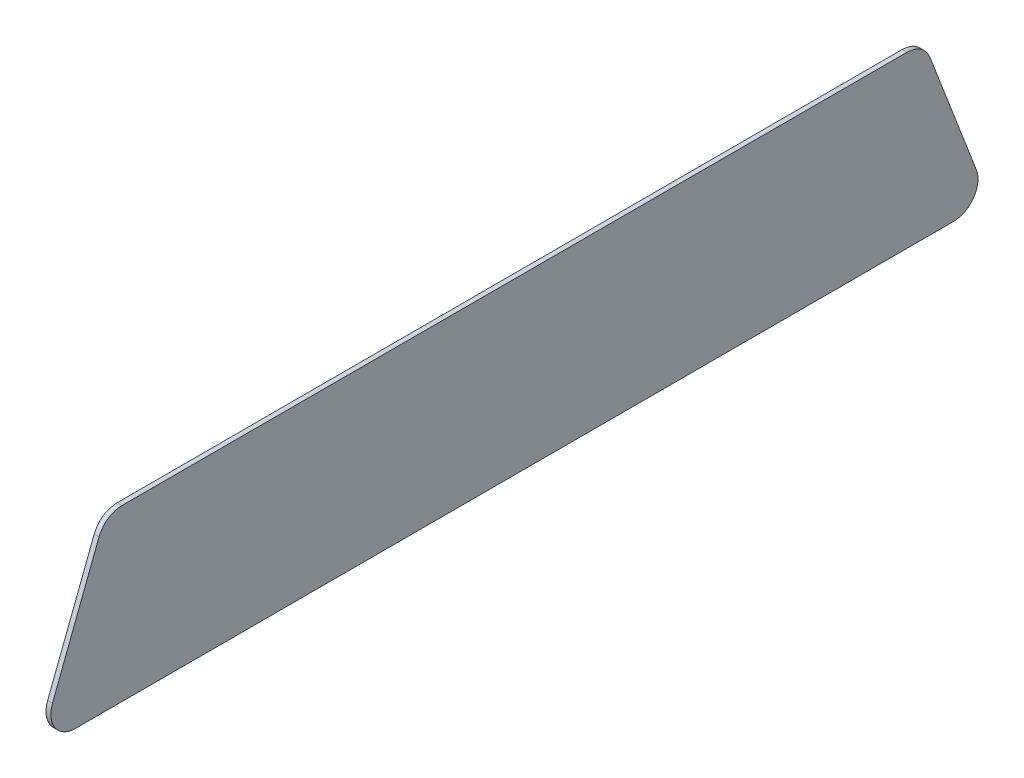
ISO-10303-21;
HEADER;
FILE_DESCRIPTION(('STEP AP214'),'2;1');
FILE_NAME('part.step','',(''),(''),'','','');
FILE_SCHEMA(('AUTOMOTIVE_DESIGN { 1 0 10303 214 1 1 1 1 }'));
ENDSEC;
DATA;
#1=APPLICATION_CONTEXT('core data for automotive mechanical design processes');
#2=APPLICATION_PROTOCOL_DEFINITION('international standard','automotive_design',2000,#1);
#3=PRODUCT_CONTEXT('',#1,'mechanical');
#4=PRODUCT('Part','Part','',(#3));
#5=PRODUCT_RELATED_PRODUCT_CATEGORY('part','',(#4));
#6=PRODUCT_DEFINITION_FORMATION('','',#4);
#7=PRODUCT_DEFINITION_CONTEXT('part definition',#1,'design');
#8=PRODUCT_DEFINITION('design','',#6,#7);
#9=PRODUCT_DEFINITION_SHAPE('','',#8);
#10=(LENGTH_UNIT() NAMED_UNIT(*) SI_UNIT(.MILLI.,.METRE.));
#11=(NAMED_UNIT(*) PLANE_ANGLE_UNIT() SI_UNIT($,.RADIAN.));
#12=(NAMED_UNIT(*) SI_UNIT($,.STERADIAN.) SOLID_ANGLE_UNIT());
#13=UNCERTAINTY_MEASURE_WITH_UNIT(LENGTH_MEASURE(1.E-05),#10,'distance_accuracy_value','');
#14=(GEOMETRIC_REPRESENTATION_CONTEXT(3) GLOBAL_UNCERTAINTY_ASSIGNED_CONTEXT((#13)) GLOBAL_UNIT_ASSIGNED_CONTEXT((#10,
#11,#12)) REPRESENTATION_CONTEXT('',''));
#15=CARTESIAN_POINT('',(0.,0.,0.));
#16=DIRECTION('',(0.,0.,1.));
#17=DIRECTION('',(1.,0.,0.));
#18=AXIS2_PLACEMENT_3D('',#15,#16,#17);
#19=CARTESIAN_POINT('',(250.,-10.4483905401593,-69.5713618482532));
#20=DIRECTION('',(-1.,0.,0.));
#21=DIRECTION('',(0.,0.,1.));
#22=AXIS2_PLACEMENT_3D('',#19,#20,#21);
#23=CYLINDRICAL_SURFACE('',#22,10.1519224698779);
#24=DIRECTION('',(1.,0.,0.));
#25=VECTOR('',#24,1.);
#26=CARTESIAN_POINT('',(250.,-6.79731489157442,-60.0987077089571));
#27=LINE('',#26,#25);
#28=CARTESIAN_POINT('',(248.,-6.79731489157442,-60.0987077089571));
#29=VERTEX_POINT('',#28);
#30=CARTESIAN_POINT('',(250.,-6.79731489157442,-60.0987077089571));
#31=VERTEX_POINT('',#30);
#32=EDGE_CURVE('E13',#29,#31,#27,.T.);
#33=ORIENTED_EDGE('',*,*,#32,.F.);
#34=CARTESIAN_POINT('',(248.,-10.4483905401593,-69.5713618482532));
#35=DIRECTION('',(1.,0.,0.));
#36=DIRECTION('',(0.,0.,-1.));
#37=AXIS2_PLACEMENT_3D('',#34,#35,#36);
#38=CIRCLE('',#37,10.1519224698779);
#39=CARTESIAN_POINT('',(248.,-20.6003130100372,-69.5713618482533));
#40=VERTEX_POINT('',#39);
#41=EDGE_CURVE('E372',#29,#40,#38,.T.);
#42=ORIENTED_EDGE('',*,*,#41,.T.);
#43=DIRECTION('',(1.,0.,0.));
#44=VECTOR('',#43,1.);
#45=CARTESIAN_POINT('',(250.,-20.6003130100372,-69.5713618482533));
#46=LINE('',#45,#44);
#47=CARTESIAN_POINT('',(250.,-20.6003130100372,-69.5713618482533));
#48=VERTEX_POINT('',#47);
#49=EDGE_CURVE('E314',#40,#48,#46,.T.);
#50=ORIENTED_EDGE('',*,*,#49,.T.);
#51=CARTESIAN_POINT('',(250.,-10.4483905401593,-69.5713618482532));
#52=DIRECTION('',(1.,0.,0.));
#53=DIRECTION('',(0.,0.,-1.));
#54=AXIS2_PLACEMENT_3D('',#51,#52,#53);
#55=CIRCLE('',#54,10.1519224698779);
#56=EDGE_CURVE('E435',#31,#48,#55,.T.);
#57=ORIENTED_EDGE('',*,*,#56,.F.);
#58=EDGE_LOOP('',(#33,#42,#50,#57));
#59=FACE_BOUND('',#58,.T.);
#60=ADVANCED_FACE('F303',(#59),#23,.T.);
#61=CARTESIAN_POINT('',(250.,-20.6003130100372,-69.5713618482533));
#62=DIRECTION('',(0.,1.,0.));
#63=DIRECTION('',(0.,0.,-1.));
#64=AXIS2_PLACEMENT_3D('',#61,#62,#63);
#65=PLANE('',#64);
#66=ORIENTED_EDGE('',*,*,#49,.F.);
#67=DIRECTION('',(0.,0.,1.));
#68=VECTOR('',#67,1.);
#69=CARTESIAN_POINT('',(248.,-20.6003130100372,-83.0756903566517));
#70=LINE('',#69,#68);
#71=CARTESIAN_POINT('',(248.,-20.6003130100367,-433.103549609214));
#72=VERTEX_POINT('',#71);
#73=EDGE_CURVE('E407',#40,#72,#70,.F.);
#74=ORIENTED_EDGE('',*,*,#73,.T.);
#75=DIRECTION('',(1.,0.,0.));
#76=VECTOR('',#75,1.);
#77=CARTESIAN_POINT('',(250.,-20.6003130100367,-433.103549609214));
#78=LINE('',#77,#76);
#79=CARTESIAN_POINT('',(250.,-20.6003130100367,-433.103549609214));
#80=VERTEX_POINT('',#79);
#81=EDGE_CURVE('E426',#72,#80,#78,.T.);
#82=ORIENTED_EDGE('',*,*,#81,.T.);
#83=DIRECTION('',(0.,0.,-1.));
#84=VECTOR('',#83,1.);
#85=CARTESIAN_POINT('',(250.,-20.6003130100372,-69.5713618482533));
#86=LINE('',#85,#84);
#87=EDGE_CURVE('E444',#48,#80,#86,.T.);
#88=ORIENTED_EDGE('',*,*,#87,.F.);
#89=EDGE_LOOP('',(#66,#74,#82,#88));
#90=FACE_BOUND('',#89,.T.);
#91=ADVANCED_FACE('F448',(#90),#65,.F.);
#92=CARTESIAN_POINT('',(250.,-10.4483905401589,-433.103549609214));
#93=DIRECTION('',(-1.,0.,0.));
#94=DIRECTION('',(0.,0.,1.));
#95=AXIS2_PLACEMENT_3D('',#92,#93,#94);
#96=CYLINDRICAL_SURFACE('',#95,10.1519224698778);
#97=ORIENTED_EDGE('',*,*,#81,.F.);
#98=CARTESIAN_POINT('',(248.,-10.4483905401589,-433.103549609214));
#99=DIRECTION('',(1.,0.,0.));
#100=DIRECTION('',(0.,0.,-1.));
#101=AXIS2_PLACEMENT_3D('',#98,#99,#100);
#102=CIRCLE('',#101,10.1519224698778);
#103=CARTESIAN_POINT('',(248.,-6.80393298914264,-442.578751928597));
#104=VERTEX_POINT('',#103);
#105=EDGE_CURVE('E403',#72,#104,#102,.T.);
#106=ORIENTED_EDGE('',*,*,#105,.T.);
#107=DIRECTION('',(1.,0.,0.));
#108=VECTOR('',#107,1.);
#109=CARTESIAN_POINT('',(250.,-6.80393298914264,-442.578751928597));
#110=LINE('',#109,#108);
#111=CARTESIAN_POINT('',(250.,-6.80393298914264,-442.578751928597));
#112=VERTEX_POINT('',#111);
#113=EDGE_CURVE('E422',#104,#112,#110,.T.);
#114=ORIENTED_EDGE('',*,*,#113,.T.);
#115=CARTESIAN_POINT('',(250.,-10.4483905401589,-433.103549609214));
#116=DIRECTION('',(1.,0.,0.));
#117=DIRECTION('',(0.,0.,-1.));
#118=AXIS2_PLACEMENT_3D('',#115,#116,#117);
#119=CIRCLE('',#118,10.1519224698778);
#120=EDGE_CURVE('E450',#80,#112,#119,.T.);
#121=ORIENTED_EDGE('',*,*,#120,.F.);
#122=EDGE_LOOP('',(#97,#106,#114,#121));
#123=FACE_BOUND('',#122,.T.);
#124=ADVANCED_FACE('F479',(#123),#96,.T.);
#125=CARTESIAN_POINT('',(250.,-6.80393298914264,-442.578751928597));
#126=DIRECTION('',(0.,-0.358991862066535,0.93334068965732));
#127=DIRECTION('',(0.,0.93334068965732,0.358991862066535));
#128=AXIS2_PLACEMENT_3D('',#125,#126,#127);
#129=PLANE('',#128);
#130=ORIENTED_EDGE('',*,*,#113,.F.);
#131=DIRECTION('',(0.,0.93334068965732,0.358991862066535));
#132=VECTOR('',#131,1.);
#133=CARTESIAN_POINT('',(248.,-6.80393298914264,-442.578751928597));
#134=LINE('',#133,#132);
#135=CARTESIAN_POINT('',(248.,43.198495664848,-423.34626247511));
#136=VERTEX_POINT('',#135);
#137=EDGE_CURVE('E396',#104,#136,#134,.T.);
#138=ORIENTED_EDGE('',*,*,#137,.T.);
#139=DIRECTION('',(1.,0.,0.));
#140=VECTOR('',#139,1.);
#141=CARTESIAN_POINT('',(250.,43.198495664848,-423.34626247511));
#142=LINE('',#141,#140);
#143=CARTESIAN_POINT('',(250.,43.198495664848,-423.34626247511));
#144=VERTEX_POINT('',#143);
#145=EDGE_CURVE('E418',#136,#144,#142,.T.);
#146=ORIENTED_EDGE('',*,*,#145,.T.);
#147=DIRECTION('',(0.,0.93334068965732,0.358991862066535));
#148=VECTOR('',#147,1.);
#149=CARTESIAN_POINT('',(250.,-6.80393298914264,-442.578751928597));
#150=LINE('',#149,#148);
#151=EDGE_CURVE('E453',#112,#144,#150,.T.);
#152=ORIENTED_EDGE('',*,*,#151,.F.);
#153=EDGE_LOOP('',(#130,#138,#146,#152));
#154=FACE_BOUND('',#153,.T.);
#155=ADVANCED_FACE('F474',(#154),#129,.F.);
#156=CARTESIAN_POINT('',(250.,43.198495664848,-423.34626247511));
#157=CARTESIAN_POINT('',(250.,49.3584780598115,-420.675389237548));
#158=CARTESIAN_POINT('',(250.,49.7059605837122,-413.871060155725));
#159=B_SPLINE_CURVE_WITH_KNOTS('',2,(#156,#157,#158),.UNSPECIFIED.,.F.,.F.,(3,3),(0.,1.),.UNSPECIFIED.);
#160=DIRECTION('',(-1.,0.,0.));
#161=VECTOR('',#160,1.);
#162=SURFACE_OF_LINEAR_EXTRUSION('',#159,#161);
#163=ORIENTED_EDGE('',*,*,#145,.F.);
#164=CARTESIAN_POINT('',(248.,43.198495664848,-423.34626247511));
#165=CARTESIAN_POINT('',(248.,49.3584780598115,-420.675389237548));
#166=CARTESIAN_POINT('',(248.,49.7059605837122,-413.871060155725));
#167=B_SPLINE_CURVE_WITH_KNOTS('',2,(#164,#165,#166),.UNSPECIFIED.,.F.,.F.,(3,3),(0.,1.),.UNSPECIFIED.);
#168=CARTESIAN_POINT('',(248.,49.7059605837122,-413.871060155725));
#169=VERTEX_POINT('',#168);
#170=EDGE_CURVE('E390',#136,#169,#167,.T.);
#171=ORIENTED_EDGE('',*,*,#170,.T.);
#172=DIRECTION('',(1.,0.,0.));
#173=VECTOR('',#172,1.);
#174=CARTESIAN_POINT('',(250.,49.7059605837122,-413.871060155725));
#175=LINE('',#174,#173);
#176=CARTESIAN_POINT('',(250.,49.7059605837122,-413.871060155725));
#177=VERTEX_POINT('',#176);
#178=EDGE_CURVE('E415',#169,#177,#175,.T.);
#179=ORIENTED_EDGE('',*,*,#178,.T.);
#180=EDGE_CURVE('E459',#144,#177,#159,.T.);
#181=ORIENTED_EDGE('',*,*,#180,.F.);
#182=EDGE_LOOP('',(#163,#171,#179,#181));
#183=FACE_BOUND('',#182,.T.);
#184=ADVANCED_FACE('F469',(#183),#162,.F.);
#185=CARTESIAN_POINT('',(250.,49.7059605837122,-413.871060155725));
#186=DIRECTION('',(0.,-1.,0.));
#187=DIRECTION('',(0.,0.,1.));
#188=AXIS2_PLACEMENT_3D('',#185,#186,#187);
#189=PLANE('',#188);
#190=ORIENTED_EDGE('',*,*,#178,.F.);
#191=DIRECTION('',(0.,0.,1.));
#192=VECTOR('',#191,1.);
#193=CARTESIAN_POINT('',(248.,49.7059605837122,-83.0756903566517));
#194=LINE('',#193,#192);
#195=CARTESIAN_POINT('',(248.,49.7059605837122,-88.8439592580283));
#196=VERTEX_POINT('',#195);
#197=EDGE_CURVE('E383',#169,#196,#194,.T.);
#198=ORIENTED_EDGE('',*,*,#197,.T.);
#199=DIRECTION('',(1.,0.,0.));
#200=VECTOR('',#199,1.);
#201=CARTESIAN_POINT('',(250.,49.7059605837122,-88.8439592580283));
#202=LINE('',#201,#200);
#203=CARTESIAN_POINT('',(250.,49.7059605837122,-88.8439592580283));
#204=VERTEX_POINT('',#203);
#205=EDGE_CURVE('E322',#196,#204,#202,.T.);
#206=ORIENTED_EDGE('',*,*,#205,.T.);
#207=DIRECTION('',(0.,0.,1.));
#208=VECTOR('',#207,1.);
#209=CARTESIAN_POINT('',(250.,49.7059605837122,-413.871060155725));
#210=LINE('',#209,#208);
#211=EDGE_CURVE('E365',#177,#204,#210,.T.);
#212=ORIENTED_EDGE('',*,*,#211,.F.);
#213=EDGE_LOOP('',(#190,#198,#206,#212));
#214=FACE_BOUND('',#213,.T.);
#215=ADVANCED_FACE('F473',(#214),#189,.F.);
#216=CARTESIAN_POINT('',(250.,49.7059605837121,-88.8439592580283));
#217=CARTESIAN_POINT('',(250.,49.3588628944782,-82.043748524923));
#218=CARTESIAN_POINT('',(250.,43.2051137624193,-79.3713051187323));
#219=B_SPLINE_CURVE_WITH_KNOTS('',2,(#216,#217,#218),.UNSPECIFIED.,.F.,.F.,(3,3),(0.,1.),.UNSPECIFIED.);
#220=DIRECTION('',(-1.,0.,0.));
#221=VECTOR('',#220,1.);
#222=SURFACE_OF_LINEAR_EXTRUSION('',#219,#221);
#223=ORIENTED_EDGE('',*,*,#205,.F.);
#224=CARTESIAN_POINT('',(248.,49.7059605837121,-88.8439592580283));
#225=CARTESIAN_POINT('',(248.,49.3588628944782,-82.043748524923));
#226=CARTESIAN_POINT('',(248.,43.2051137624193,-79.3713051187323));
#227=B_SPLINE_CURVE_WITH_KNOTS('',2,(#224,#225,#226),.UNSPECIFIED.,.F.,.F.,(3,3),(0.,1.),.UNSPECIFIED.);
#228=CARTESIAN_POINT('',(248.,43.2051137624194,-79.3713051187323));
#229=VERTEX_POINT('',#228);
#230=EDGE_CURVE('E370',#196,#229,#227,.T.);
#231=ORIENTED_EDGE('',*,*,#230,.T.);
#232=DIRECTION('',(1.,0.,0.));
#233=VECTOR('',#232,1.);
#234=CARTESIAN_POINT('',(250.,43.2051137624194,-79.3713051187323));
#235=LINE('',#234,#233);
#236=CARTESIAN_POINT('',(250.,43.2051137624194,-79.3713051187323));
#237=VERTEX_POINT('',#236);
#238=EDGE_CURVE('E307',#229,#237,#235,.T.);
#239=ORIENTED_EDGE('',*,*,#238,.T.);
#240=EDGE_CURVE('E389',#204,#237,#219,.T.);
#241=ORIENTED_EDGE('',*,*,#240,.F.);
#242=EDGE_LOOP('',(#223,#231,#239,#241));
#243=FACE_BOUND('',#242,.T.);
#244=ADVANCED_FACE('F375',(#243),#222,.F.);
#245=CARTESIAN_POINT('',(250.,43.2051137624194,-79.3713051187323));
#246=DIRECTION('',(0.,-0.359643767908786,-0.933089684973728));
#247=DIRECTION('',(0.,-0.933089684973728,0.359643767908786));
#248=AXIS2_PLACEMENT_3D('',#245,#246,#247);
#249=PLANE('',#248);
#250=DIRECTION('',(0.,-0.933089684973728,0.359643767908786));
#251=VECTOR('',#250,1.);
#252=CARTESIAN_POINT('',(248.,43.2051137624194,-79.3713051187323));
#253=LINE('',#252,#251);
#254=EDGE_CURVE('E358',#229,#29,#253,.T.);
#255=ORIENTED_EDGE('',*,*,#254,.T.);
#256=ORIENTED_EDGE('',*,*,#32,.T.);
#257=DIRECTION('',(0.,-0.933089684973728,0.359643767908786));
#258=VECTOR('',#257,1.);
#259=CARTESIAN_POINT('',(250.,43.2051137624194,-79.3713051187323));
#260=LINE('',#259,#258);
#261=EDGE_CURVE('E360',#237,#31,#260,.T.);
#262=ORIENTED_EDGE('',*,*,#261,.F.);
#263=ORIENTED_EDGE('',*,*,#238,.F.);
#264=EDGE_LOOP('',(#255,#256,#262,#263));
#265=FACE_BOUND('',#264,.T.);
#266=ADVANCED_FACE('F305',(#265),#249,.F.);
#267=CARTESIAN_POINT('',(250.,47.907200033772,-83.0756903566517));
#268=DIRECTION('',(-1.,0.,0.));
#269=DIRECTION('',(0.,0.,1.));
#270=AXIS2_PLACEMENT_3D('',#267,#268,#269);
#271=PLANE('',#270);
#272=ORIENTED_EDGE('',*,*,#240,.T.);
#273=ORIENTED_EDGE('',*,*,#261,.T.);
#274=ORIENTED_EDGE('',*,*,#56,.T.);
#275=ORIENTED_EDGE('',*,*,#87,.T.);
#276=ORIENTED_EDGE('',*,*,#120,.T.);
#277=ORIENTED_EDGE('',*,*,#151,.T.);
#278=ORIENTED_EDGE('',*,*,#180,.T.);
#279=ORIENTED_EDGE('',*,*,#211,.T.);
#280=EDGE_LOOP('',(#272,#273,#274,#275,#276,#277,#278,#279));
#281=FACE_BOUND('',#280,.T.);
#282=ADVANCED_FACE('F442',(#281),#271,.F.);
#283=CARTESIAN_POINT('',(248.,47.907200033772,-83.0756903566517));
#284=DIRECTION('',(-1.,0.,0.));
#285=DIRECTION('',(0.,0.,1.));
#286=AXIS2_PLACEMENT_3D('',#283,#284,#285);
#287=PLANE('',#286);
#288=ORIENTED_EDGE('',*,*,#230,.F.);
#289=ORIENTED_EDGE('',*,*,#197,.F.);
#290=ORIENTED_EDGE('',*,*,#170,.F.);
#291=ORIENTED_EDGE('',*,*,#137,.F.);
#292=ORIENTED_EDGE('',*,*,#105,.F.);
#293=ORIENTED_EDGE('',*,*,#73,.F.);
#294=ORIENTED_EDGE('',*,*,#41,.F.);
#295=ORIENTED_EDGE('',*,*,#254,.F.);
#296=EDGE_LOOP('',(#288,#289,#290,#291,#292,#293,#294,#295));
#297=FACE_BOUND('',#296,.T.);
#298=ADVANCED_FACE('F368',(#297),#287,.T.);
#299=CLOSED_SHELL('',(#60,#91,#124,#155,#184,#215,#244,#266,#282,#298));
#300=MANIFOLD_SOLID_BREP('B2',#299);
#301=CARTESIAN_POINT('',(250.,49.7059605837121,-88.8439592580283));
#302=CARTESIAN_POINT('',(248.120614758428,49.0228096267602,-88.878828783086));
#303=CARTESIAN_POINT('',(250.,49.677035776276,-88.2772750302695));
#304=CARTESIAN_POINT('',(248.120614758428,48.9785197893924,-88.3507156895247));
#305=CARTESIAN_POINT('',(250.,49.5587002088742,-87.186904151074));
#306=CARTESIAN_POINT('',(248.120614758428,48.8899401146567,-87.2944895024021));
#307=CARTESIAN_POINT('',(250.,49.080085263953,-85.1781526979711));
#308=CARTESIAN_POINT('',(248.120614758428,48.4266517342813,-85.4143255546724));
#309=CARTESIAN_POINT('',(250.,48.0281719388308,-82.9896952040076));
#310=CARTESIAN_POINT('',(248.120614758428,47.4574860992813,-83.3807786643272));
#311=CARTESIAN_POINT('',(250.,46.3713990884144,-81.2312134732644));
#312=CARTESIAN_POINT('',(248.120614758428,45.9168891842483,-81.7570867172908));
#313=CARTESIAN_POINT('',(250.,44.6830650929046,-80.082413546602));
#314=CARTESIAN_POINT('',(248.120614758428,44.3453805688914,-80.6695969880209));
#315=CARTESIAN_POINT('',(250.,43.7179261900909,-79.5940087359148));
#316=CARTESIAN_POINT('',(248.120614758428,43.4035500958147,-80.2223546560242));
#317=CARTESIAN_POINT('',(250.,43.2051137624193,-79.3713051187323));
#318=CARTESIAN_POINT('',(248.120614758428,42.9326348592764,-79.9987334900258));
#319=B_SPLINE_SURFACE_WITH_KNOTS('',3,1,((#301,#302),(#303,#304),(#305,#306),(#307,#308),(#309,
#310),(#311,#312),(#313,#314),(#315,#316),(#317,#318)),.UNSPECIFIED.,.F.,.F.,.F.,(4,1,1,1,1,1,
4),(2,2),(0.,0.125,0.25,0.5,0.75,0.875,1.),(0.,1.),.UNSPECIFIED.);
#320=CARTESIAN_POINT('',(249.999999999976,43.2051137624158,-79.3713051187404));
#321=CARTESIAN_POINT('',(249.939418540685,43.1967525329749,-79.3917134154622));
#322=CARTESIAN_POINT('',(249.878837303244,43.188359619844,-79.4121093522091));
#323=CARTESIAN_POINT('',(249.752610085859,43.1708171223944,-79.4545851255414));
#324=CARTESIAN_POINT('',(249.686964142151,43.1616629443372,-79.4766631731117));
#325=CARTESIAN_POINT('',(249.550607514392,43.1425979879657,-79.522503278767));
#326=CARTESIAN_POINT('',(249.479896866659,43.1326833309909,-79.5462638305783));
#327=CARTESIAN_POINT('',(249.333410830455,43.1120964208663,-79.5954685982955));
#328=CARTESIAN_POINT('',(249.257635476825,43.1014207738831,-79.6209114976336));
#329=CARTESIAN_POINT('',(249.101020030697,43.0793114620444,-79.673480812223));
#330=CARTESIAN_POINT('',(249.020179970888,43.0678748292022,-79.7006060762053));
#331=CARTESIAN_POINT('',(248.853435114742,43.0442431379303,-79.7565399467413));
#332=CARTESIAN_POINT('',(248.76753034842,43.0320454580677,-79.7853475350029));
#333=CARTESIAN_POINT('',(248.590656081453,43.0068915432306,-79.8446459599084));
#334=CARTESIAN_POINT('',(248.49968660778,42.9939329883693,-79.8751358926654));
#335=CARTESIAN_POINT('',(248.312682931429,42.9672568784064,-79.9377987595103));
#336=CARTESIAN_POINT('',(248.21664875262,42.9535372369217,-79.9699708767462));
#337=CARTESIAN_POINT('',(248.120614758428,42.9398010468146,-80.0021364672718));
#338=B_SPLINE_CURVE_WITH_KNOTS('',3,(#320,#321,#322,#323,#324,#325,#326,#327,#328,#329,#330,
#331,#332,#333,#334,#335,#336,#337),.UNSPECIFIED.,.F.,.F.,(4,2,2,2,2,2,2,2,4),(0.,
0.193413255206542,0.402997724406666,0.628753635484742,0.870681155796118,1.12878039906253,
1.40305143027257,1.69349426924378,2.00010889325958),.UNSPECIFIED.);
#339=CARTESIAN_POINT('',(248.120614758428,42.9398010327751,-80.0021364606049));
#340=VERTEX_POINT('',#339);
#341=CARTESIAN_POINT('',(249.999999999994,43.2051137624185,-79.3713051187343));
#342=VERTEX_POINT('',#341);
#343=EDGE_CURVE('E599',#340,#342,#338,.F.);
#344=CARTESIAN_POINT('',(248.120614758428,49.0228096267602,-88.878828783086));
#345=CARTESIAN_POINT('',(248.120614758428,48.9785197893924,-88.3507156895247));
#346=CARTESIAN_POINT('',(248.120614758428,48.8899401146567,-87.2944895024021));
#347=CARTESIAN_POINT('',(248.120614758428,48.4266517342813,-85.4143255546724));
#348=CARTESIAN_POINT('',(248.120614758428,47.4574860992813,-83.3807786643272));
#349=CARTESIAN_POINT('',(248.120614758428,45.9168891842483,-81.7570867172908));
#350=CARTESIAN_POINT('',(248.120614758428,44.3453805688914,-80.6695969880209));
#351=CARTESIAN_POINT('',(248.120614758428,43.4035500958147,-80.2223546560242));
#352=CARTESIAN_POINT('',(248.120614758428,42.9326348592764,-79.9987334900258));
#353=B_SPLINE_CURVE_WITH_KNOTS('',3,(#344,#345,#346,#347,#348,#349,#350,#351,#352),
.UNSPECIFIED.,.F.,.F.,(4,1,1,1,1,1,4),(0.,0.125,0.25,0.5,0.75,0.875,1.),.UNSPECIFIED.);
#354=CARTESIAN_POINT('',(248.120614758428,49.0219202970608,-88.8682245307919));
#355=VERTEX_POINT('',#354);
#356=EDGE_CURVE('E752',#340,#355,#353,.F.);
#357=CARTESIAN_POINT('',(248.120614758428,49.0219202970608,-88.8682245307919));
#358=CARTESIAN_POINT('',(249.262704108098,49.4376068252132,-88.8508034856746));
#359=CARTESIAN_POINT('',(249.999999999941,49.7059605836908,-88.8439592580293));
#360=B_SPLINE_CURVE_WITH_KNOTS('',2,(#357,#358,#359),.UNSPECIFIED.,.F.,.F.,(3,3),(0.,1.),.UNSPECIFIED.);
#361=CARTESIAN_POINT('',(249.999999999971,49.7059605837015,-88.8439592580288));
#362=VERTEX_POINT('',#361);
#363=EDGE_CURVE('E590',#362,#355,#360,.F.);
#364=CARTESIAN_POINT('',(250.,49.7059605837121,-88.8439592580283));
#365=CARTESIAN_POINT('',(250.,49.677035776276,-88.2772750302695));
#366=CARTESIAN_POINT('',(250.,49.5587002088742,-87.186904151074));
#367=CARTESIAN_POINT('',(250.,49.080085263953,-85.1781526979711));
#368=CARTESIAN_POINT('',(250.,48.0281719388308,-82.9896952040076));
#369=CARTESIAN_POINT('',(250.,46.3713990884144,-81.2312134732644));
#370=CARTESIAN_POINT('',(250.,44.6830650929046,-80.082413546602));
#371=CARTESIAN_POINT('',(250.,43.7179261900909,-79.5940087359148));
#372=CARTESIAN_POINT('',(250.,43.2051137624193,-79.3713051187323));
#373=B_SPLINE_CURVE_WITH_KNOTS('',3,(#364,#365,#366,#367,#368,#369,#370,#371,#372),
.UNSPECIFIED.,.F.,.F.,(4,1,1,1,1,1,4),(0.,0.125,0.25,0.5,0.75,0.875,1.),.UNSPECIFIED.);
#374=EDGE_CURVE('E301',#362,#342,#373,.T.);
#375=ORIENTED_EDGE('',*,*,#343,.F.);
#376=ORIENTED_EDGE('',*,*,#356,.T.);
#377=ORIENTED_EDGE('',*,*,#363,.F.);
#378=ORIENTED_EDGE('',*,*,#374,.T.);
#379=EDGE_LOOP('',(#375,#376,#377,#378));
#380=FACE_BOUND('',#379,.T.);
#381=ADVANCED_FACE('F577',(#380),#319,.T.);
#382=CARTESIAN_POINT('',(250.,49.7059605837122,-413.871060155725));
#383=DIRECTION('',(0.342020143325667,-0.939692620785909,0.));
#384=DIRECTION('',(0.,0.,1.));
#385=AXIS2_PLACEMENT_3D('',#382,#383,#384);
#386=PLANE('',#385);
#387=CARTESIAN_POINT('',(250.,49.7059605837122,-413.871060155725));
#388=CARTESIAN_POINT('',(249.262689702579,49.4376015820331,-413.864212357513));
#389=CARTESIAN_POINT('',(248.120614758428,49.0219202970608,-413.846782923901));
#390=B_SPLINE_CURVE_WITH_KNOTS('',2,(#387,#388,#389),.UNSPECIFIED.,.F.,.F.,(3,3),(0.,1.),.UNSPECIFIED.);
#391=CARTESIAN_POINT('',(250.,49.7059605837122,-413.871060155725));
#392=VERTEX_POINT('',#391);
#393=CARTESIAN_POINT('',(248.120614758428,49.0219202944093,-413.846782955501));
#394=VERTEX_POINT('',#393);
#395=EDGE_CURVE('E772',#392,#394,#390,.T.);
#396=ORIENTED_EDGE('',*,*,#395,.F.);
#397=DIRECTION('',(0.,0.,1.));
#398=VECTOR('',#397,1.);
#399=CARTESIAN_POINT('',(250.,49.7059605837122,-251.357509706877));
#400=LINE('',#399,#398);
#401=EDGE_CURVE('E776',#392,#362,#400,.T.);
#402=ORIENTED_EDGE('',*,*,#401,.T.);
#403=ORIENTED_EDGE('',*,*,#363,.T.);
#404=DIRECTION('',(0.,0.,-1.));
#405=VECTOR('',#404,1.);
#406=CARTESIAN_POINT('',(248.120614758428,49.0219202970608,-251.357509706877));
#407=LINE('',#406,#405);
#408=EDGE_CURVE('E753',#355,#394,#407,.T.);
#409=ORIENTED_EDGE('',*,*,#408,.T.);
#410=EDGE_LOOP('',(#396,#402,#403,#409));
#411=FACE_BOUND('',#410,.T.);
#412=ADVANCED_FACE('F815',(#411),#386,.T.);
#413=CARTESIAN_POINT('',(250.,43.2051137624193,-79.3713051187323));
#414=DIRECTION('',(0.342020143325664,-0.337954594815526,-0.876817491501262));
#415=DIRECTION('',(0.,-0.933089684973728,0.359643767908786));
#416=AXIS2_PLACEMENT_3D('',#413,#414,#415);
#417=PLANE('',#416);
#418=ORIENTED_EDGE('',*,*,#343,.T.);
#419=DIRECTION('',(0.,-0.933089684973728,0.359643767908786));
#420=VECTOR('',#419,1.);
#421=CARTESIAN_POINT('',(250.,18.2038994354225,-69.7350064138447));
#422=LINE('',#421,#420);
#423=CARTESIAN_POINT('',(250.,-6.79731489157442,-60.0987077089571));
#424=VERTEX_POINT('',#423);
#425=EDGE_CURVE('E735',#342,#424,#422,.T.);
#426=ORIENTED_EDGE('',*,*,#425,.T.);
#427=DIRECTION('',(-0.939692620785909,-0.123005413046346,-0.319135467790417));
#428=VECTOR('',#427,1.);
#429=CARTESIAN_POINT('',(249.060307379214,-6.92032030462078,-60.4178431767476));
#430=LINE('',#429,#428);
#431=CARTESIAN_POINT('',(248.120614758428,-7.04332571766712,-60.736978644538));
#432=VERTEX_POINT('',#431);
#433=EDGE_CURVE('E730',#424,#432,#430,.T.);
#434=ORIENTED_EDGE('',*,*,#433,.T.);
#435=DIRECTION('',(0.,0.933089684973728,-0.359643767908785));
#436=VECTOR('',#435,1.);
#437=CARTESIAN_POINT('',(248.120614758428,17.9578886093298,-70.3732773494255));
#438=LINE('',#437,#436);
#439=EDGE_CURVE('E734',#432,#340,#438,.T.);
#440=ORIENTED_EDGE('',*,*,#439,.T.);
#441=EDGE_LOOP('',(#418,#426,#434,#440));
#442=FACE_BOUND('',#441,.T.);
#443=ADVANCED_FACE('F804',(#442),#417,.T.);
#444=CARTESIAN_POINT('',(250.,43.198495664848,-423.34626247511));
#445=CARTESIAN_POINT('',(248.120614758428,42.92638342601,-422.718674996557));
#446=CARTESIAN_POINT('',(250.,43.711827531095,-423.123689705313));
#447=CARTESIAN_POINT('',(248.120614758428,43.3977897018017,-422.495155251068));
#448=CARTESIAN_POINT('',(250.,44.677944389932,-422.635487334008));
#449=CARTESIAN_POINT('',(248.120614758428,44.3406022533851,-422.04811576009));
#450=CARTESIAN_POINT('',(250.,46.3679906129784,-421.486855264555));
#451=CARTESIAN_POINT('',(248.120614758428,45.9137349595079,-420.96074838684));
#452=CARTESIAN_POINT('',(250.,48.0264468393596,-419.728138939905));
#453=CARTESIAN_POINT('',(248.120614758428,47.4558912231137,-419.336846545633));
#454=CARTESIAN_POINT('',(250.,49.0794343291718,-417.538854298145));
#455=CARTESIAN_POINT('',(248.120614758428,48.4260320102283,-417.302557026613));
#456=CARTESIAN_POINT('',(250.,49.5585430790801,-415.52908559447));
#457=CARTESIAN_POINT('',(248.120614758428,48.8897978531862,-415.421454707875));
#458=CARTESIAN_POINT('',(250.,49.6770037067205,-414.438087579211));
#459=CARTESIAN_POINT('',(248.120614758428,48.9784729640906,-414.364600331955));
#460=CARTESIAN_POINT('',(250.,49.7059605837122,-413.871060155725));
#461=CARTESIAN_POINT('',(248.120614758428,49.0228105195429,-413.836173143994));
#462=B_SPLINE_SURFACE_WITH_KNOTS('',3,1,((#444,#445),(#446,#447),(#448,#449),(#450,#451),(#452,
#453),(#454,#455),(#456,#457),(#458,#459),(#460,#461)),.UNSPECIFIED.,.F.,.F.,.F.,(4,1,1,1,1,1,
4),(2,2),(0.,0.125,0.25,0.5,0.75,0.875,1.),(0.,1.),.UNSPECIFIED.);
#463=CARTESIAN_POINT('',(248.120614758428,42.92638342601,-422.718674996557));
#464=CARTESIAN_POINT('',(248.120614758428,43.3977897018017,-422.495155251068));
#465=CARTESIAN_POINT('',(248.120614758428,44.3406022533851,-422.04811576009));
#466=CARTESIAN_POINT('',(248.120614758428,45.9137349595079,-420.96074838684));
#467=CARTESIAN_POINT('',(248.120614758428,47.4558912231137,-419.336846545633));
#468=CARTESIAN_POINT('',(248.120614758428,48.4260320102283,-417.302557026613));
#469=CARTESIAN_POINT('',(248.120614758428,48.8897978531862,-415.421454707875));
#470=CARTESIAN_POINT('',(248.120614758428,48.9784729640906,-414.364600331955));
#471=CARTESIAN_POINT('',(248.120614758428,49.0228105195429,-413.836173143994));
#472=B_SPLINE_CURVE_WITH_KNOTS('',3,(#463,#464,#465,#466,#467,#468,#469,#470,#471),
.UNSPECIFIED.,.F.,.F.,(4,1,1,1,1,1,4),(0.,0.125,0.25,0.5,0.75,0.875,1.),.UNSPECIFIED.);
#473=CARTESIAN_POINT('',(248.120614758428,42.9335794199333,-422.715262972866));
#474=VERTEX_POINT('',#473);
#475=EDGE_CURVE('E765',#394,#474,#472,.F.);
#476=CARTESIAN_POINT('',(248.120614758428,42.9335794199335,-422.715262972866));
#477=CARTESIAN_POINT('',(248.216613875114,42.9472908497805,-422.747425429867));
#478=CARTESIAN_POINT('',(248.312613177476,42.9609856823922,-422.779594419272));
#479=CARTESIAN_POINT('',(248.499557065702,42.9876145409349,-422.84225392522));
#480=CARTESIAN_POINT('',(248.590501627621,43.0005506552188,-422.872743625812));
#481=CARTESIAN_POINT('',(248.76733603585,43.0256620553286,-422.932044481196));
#482=CARTESIAN_POINT('',(248.853225855114,43.0378396628298,-422.960854733249));
#483=CARTESIAN_POINT('',(249.019950781912,43.0614335764347,-423.016796825631));
#484=CARTESIAN_POINT('',(249.100785859359,43.0728525053935,-423.04392764919));
#485=CARTESIAN_POINT('',(249.257401305529,43.0949287770037,-423.096510976823));
#486=CARTESIAN_POINT('',(249.333181641494,43.1055890885522,-423.12196233162));
#487=CARTESIAN_POINT('',(249.479687607128,43.1261476965036,-423.171186903358));
#488=CARTESIAN_POINT('',(249.550413201893,43.1360493868296,-423.19495880638));
#489=CARTESIAN_POINT('',(249.686809688471,43.1550907784387,-423.240824507628));
#490=CARTESIAN_POINT('',(249.752480543905,43.1642343574405,-423.262916803019));
#491=CARTESIAN_POINT('',(249.878767549497,43.1817580304835,-423.305423961864));
#492=CARTESIAN_POINT('',(249.939383663358,43.1901427151008,-423.325837041193));
#493=CARTESIAN_POINT('',(250.,43.198495664848,-423.34626247511));
#494=B_SPLINE_CURVE_WITH_KNOTS('',3,(#476,#477,#478,#479,#480,#481,#482,#483,#484,#485,#486,
#487,#488,#489,#490,#491,#492,#493),.UNSPECIFIED.,.F.,.F.,(4,2,2,2,2,2,2,2,4),(0.,
0.306503374022623,0.596866765772341,0.871090152872682,1.12917355549397,1.3711170389927,
1.59692071747419,1.80658475869006,2.00010939092648),.UNSPECIFIED.);
#495=CARTESIAN_POINT('',(250.,43.198495664848,-423.34626247511));
#496=VERTEX_POINT('',#495);
#497=EDGE_CURVE('E760',#496,#474,#494,.F.);
#498=CARTESIAN_POINT('',(250.,43.198495664848,-423.34626247511));
#499=CARTESIAN_POINT('',(250.,43.711827531095,-423.123689705313));
#500=CARTESIAN_POINT('',(250.,44.677944389932,-422.635487334008));
#501=CARTESIAN_POINT('',(250.,46.3679906129784,-421.486855264555));
#502=CARTESIAN_POINT('',(250.,48.0264468393596,-419.728138939905));
#503=CARTESIAN_POINT('',(250.,49.0794343291718,-417.538854298145));
#504=CARTESIAN_POINT('',(250.,49.5585430790801,-415.52908559447));
#505=CARTESIAN_POINT('',(250.,49.6770037067205,-414.438087579211));
#506=CARTESIAN_POINT('',(250.,49.7059605837122,-413.871060155725));
#507=B_SPLINE_CURVE_WITH_KNOTS('',3,(#498,#499,#500,#501,#502,#503,#504,#505,#506),
.UNSPECIFIED.,.F.,.F.,(4,1,1,1,1,1,4),(0.,0.125,0.25,0.5,0.75,0.875,1.),.UNSPECIFIED.);
#508=EDGE_CURVE('E627',#496,#392,#507,.T.);
#509=ORIENTED_EDGE('',*,*,#395,.T.);
#510=ORIENTED_EDGE('',*,*,#475,.T.);
#511=ORIENTED_EDGE('',*,*,#497,.F.);
#512=ORIENTED_EDGE('',*,*,#508,.T.);
#513=EDGE_LOOP('',(#509,#510,#511,#512));
#514=FACE_BOUND('',#513,.T.);
#515=ADVANCED_FACE('F814',(#514),#462,.T.);
#516=CARTESIAN_POINT('',(250.,-6.79731489157442,-60.0987077089571));
#517=CARTESIAN_POINT('',(248.120614758428,-7.04332571766712,-60.736978644538));
#518=CARTESIAN_POINT('',(250.,-7.12874066178043,-59.9709652049959));
#519=CARTESIAN_POINT('',(248.120614758428,-7.35514348115778,-60.6272194687569));
#520=CARTESIAN_POINT('',(250.,-7.82217363501109,-59.7443294129943));
#521=CARTESIAN_POINT('',(248.120614758428,-7.97877900813909,-60.4077011171946));
#522=CARTESIAN_POINT('',(250.,-9.32192035041173,-59.428902646687));
#523=CARTESIAN_POINT('',(248.120614758428,-9.36113746833054,-60.1206161893201));
#524=CARTESIAN_POINT('',(250.,-11.3621888780687,-59.3570696908054));
#525=CARTESIAN_POINT('',(248.120614758428,-11.2484036443305,-60.0395824502219));
#526=CARTESIAN_POINT('',(250.,-13.8829752568569,-59.8970466062153));
#527=CARTESIAN_POINT('',(248.120614758428,-13.6251393828708,-60.5384967751461));
#528=CARTESIAN_POINT('',(250.,-16.2595325874247,-61.1037052057735));
#529=CARTESIAN_POINT('',(248.120614758428,-15.8687094746544,-61.6731898096547));
#530=CARTESIAN_POINT('',(250.,-18.2401673129739,-62.8872790913503));
#531=CARTESIAN_POINT('',(248.120614758428,-17.7343658421423,-63.358556641463));
#532=CARTESIAN_POINT('',(250.,-19.6505993142274,-65.0451995269782));
#533=CARTESIAN_POINT('',(248.120614758428,-19.0546758487469,-65.396832815324));
#534=CARTESIAN_POINT('',(250.,-20.3173425848854,-66.9747873196247));
#535=CARTESIAN_POINT('',(248.120614758428,-19.6578076212429,-67.1869646962063));
#536=CARTESIAN_POINT('',(250.,-20.5623956825149,-68.4876267805723));
#537=CARTESIAN_POINT('',(248.120614758428,-19.8870882415557,-68.5800774215178));
#538=CARTESIAN_POINT('',(250.,-20.6003130100373,-69.2161700852929));
#539=CARTESIAN_POINT('',(248.120614758428,-19.9065445627758,-69.2409337060081));
#540=CARTESIAN_POINT('',(250.,-20.6003130100372,-69.5713618482533));
#541=CARTESIAN_POINT('',(248.120614758428,-19.9162727233859,-69.5713618482533));
#542=(BOUNDED_SURFACE() B_SPLINE_SURFACE(3,1,((#516,#517),(#518,#519),(#520,#521),(#522,#523),
(#524,#525),(#526,#527),(#528,#529),(#530,#531),(#532,#533),(#534,#535),(#536,#537),(#538,#539),
(#540,#541)),.UNSPECIFIED.,.F.,.F.,.F.) B_SPLINE_SURFACE_WITH_KNOTS((4,1,1,1,1,1,1,1,1,1,4),(2,
2),(0.,0.0625,0.125,0.25,0.375,0.5,0.625,0.75,0.875,0.9375,1.),(0.,1.),
.UNSPECIFIED.) GEOMETRIC_REPRESENTATION_ITEM() RATIONAL_B_SPLINE_SURFACE(((1.,1.),
(0.98191011820323,1.),(0.947991589834285,1.),(0.889199473994782,1.),(0.832668593379875,1.),
(0.791966359337142,1.),(0.778398947989564,1.),(0.791966359337142,1.),(0.832668593379875,1.),
(0.889199473994782,1.),(0.947991589834285,1.),(0.98191011820323,1.),(1.,1.))) REPRESENTATION_ITEM('') SURFACE());
#543=CARTESIAN_POINT('',(250.,-6.79731489157442,-60.0987077089571));
#544=CARTESIAN_POINT('',(250.,-7.12874066178043,-59.9709652049959));
#545=CARTESIAN_POINT('',(250.,-7.82217363501109,-59.7443294129943));
#546=CARTESIAN_POINT('',(250.,-9.32192035041173,-59.428902646687));
#547=CARTESIAN_POINT('',(250.,-11.3621888780687,-59.3570696908054));
#548=CARTESIAN_POINT('',(250.,-13.8829752568569,-59.8970466062153));
#549=CARTESIAN_POINT('',(250.,-16.2595325874247,-61.1037052057735));
#550=CARTESIAN_POINT('',(250.,-18.2401673129739,-62.8872790913503));
#551=CARTESIAN_POINT('',(250.,-19.6505993142274,-65.0451995269782));
#552=CARTESIAN_POINT('',(250.,-20.3173425848854,-66.9747873196247));
#553=CARTESIAN_POINT('',(250.,-20.5623956825149,-68.4876267805723));
#554=CARTESIAN_POINT('',(250.,-20.6003130100373,-69.2161700852929));
#555=CARTESIAN_POINT('',(250.,-20.6003130100372,-69.5713618482533));
#556=(BOUNDED_CURVE() B_SPLINE_CURVE(3,(#543,#544,#545,#546,#547,#548,#549,#550,#551,#552,#553,
#554,#555),.UNSPECIFIED.,.F.,.F.) B_SPLINE_CURVE_WITH_KNOTS((4,1,1,1,1,1,1,1,1,1,4),(0.,0.0625,
0.125,0.25,0.375,0.5,0.625,0.75,0.875,0.9375,1.),
.UNSPECIFIED.) CURVE() GEOMETRIC_REPRESENTATION_ITEM() RATIONAL_B_SPLINE_CURVE((1.,
0.98191011820323,0.947991589834285,0.889199473994782,0.832668593379875,0.791966359337142,
0.778398947989564,0.791966359337142,0.832668593379875,0.889199473994782,0.947991589834285,
0.98191011820323,1.)) REPRESENTATION_ITEM(''));
#557=CARTESIAN_POINT('',(250.,-20.6003130100372,-69.5713618482533));
#558=VERTEX_POINT('',#557);
#559=EDGE_CURVE('E697',#424,#558,#556,.T.);
#560=DIRECTION('',(-0.939692620785909,0.342020143325667,0.));
#561=VECTOR('',#560,1.);
#562=CARTESIAN_POINT('',(249.060307379214,-20.2582928667116,-69.5713618482533));
#563=LINE('',#562,#561);
#564=CARTESIAN_POINT('',(248.120614758428,-19.9162727233859,-69.5713618482533));
#565=VERTEX_POINT('',#564);
#566=EDGE_CURVE('E705',#558,#565,#563,.T.);
#567=CARTESIAN_POINT('',(248.120614758428,-7.04332571766712,-60.736978644538));
#568=CARTESIAN_POINT('',(248.120614758428,-7.35514348115778,-60.6272194687569));
#569=CARTESIAN_POINT('',(248.120614758428,-7.97877900813909,-60.4077011171946));
#570=CARTESIAN_POINT('',(248.120614758428,-9.36113746833054,-60.1206161893201));
#571=CARTESIAN_POINT('',(248.120614758428,-11.2484036443305,-60.0395824502219));
#572=CARTESIAN_POINT('',(248.120614758428,-13.6251393828708,-60.5384967751461));
#573=CARTESIAN_POINT('',(248.120614758428,-15.8687094746544,-61.6731898096547));
#574=CARTESIAN_POINT('',(248.120614758428,-17.7343658421423,-63.358556641463));
#575=CARTESIAN_POINT('',(248.120614758428,-19.0546758487469,-65.396832815324));
#576=CARTESIAN_POINT('',(248.120614758428,-19.6578076212429,-67.1869646962063));
#577=CARTESIAN_POINT('',(248.120614758428,-19.8870882415557,-68.5800774215178));
#578=CARTESIAN_POINT('',(248.120614758428,-19.9065445627758,-69.2409337060081));
#579=CARTESIAN_POINT('',(248.120614758428,-19.9162727233859,-69.5713618482533));
#580=B_SPLINE_CURVE_WITH_KNOTS('',3,(#567,#568,#569,#570,#571,#572,#573,#574,#575,#576,#577,
#578,#579),.UNSPECIFIED.,.F.,.F.,(4,1,1,1,1,1,1,1,1,1,4),(0.,0.0625,0.125,0.25,0.375,0.5,0.625,
0.75,0.875,0.9375,1.),.UNSPECIFIED.);
#581=EDGE_CURVE('E635',#565,#432,#580,.F.);
#582=ORIENTED_EDGE('',*,*,#559,.T.);
#583=ORIENTED_EDGE('',*,*,#566,.T.);
#584=ORIENTED_EDGE('',*,*,#581,.T.);
#585=ORIENTED_EDGE('',*,*,#433,.F.);
#586=EDGE_LOOP('',(#582,#583,#584,#585));
#587=FACE_BOUND('',#586,.T.);
#588=ADVANCED_FACE('F823',(#587),#542,.T.);
#589=CARTESIAN_POINT('',(250.,-6.80393298914264,-442.578751928597));
#590=DIRECTION('',(0.342020143325658,-0.337342003706117,0.877053358750218));
#591=DIRECTION('',(0.,0.93334068965732,0.358991862066536));
#592=AXIS2_PLACEMENT_3D('',#589,#590,#591);
#593=PLANE('',#592);
#594=ORIENTED_EDGE('',*,*,#497,.T.);
#595=DIRECTION('',(0.,-0.933340689657322,-0.358991862066531));
#596=VECTOR('',#595,1.);
#597=CARTESIAN_POINT('',(248.120614758428,17.9517164416192,-432.324064568957));
#598=LINE('',#597,#596);
#599=CARTESIAN_POINT('',(248.120614758428,-7.04949788537611,-441.940309295701));
#600=VERTEX_POINT('',#599);
#601=EDGE_CURVE('E672',#474,#600,#598,.T.);
#602=ORIENTED_EDGE('',*,*,#601,.T.);
#603=DIRECTION('',(0.939692620785912,0.122782448116745,-0.319221316448264));
#604=VECTOR('',#603,1.);
#605=CARTESIAN_POINT('',(249.060307379214,-6.92671543725938,-442.259530612149));
#606=LINE('',#605,#604);
#607=CARTESIAN_POINT('',(250.,-6.80393298914263,-442.578751928597));
#608=VERTEX_POINT('',#607);
#609=EDGE_CURVE('E658',#600,#608,#606,.T.);
#610=ORIENTED_EDGE('',*,*,#609,.T.);
#611=DIRECTION('',(0.,0.933340689657321,0.358991862066534));
#612=VECTOR('',#611,1.);
#613=CARTESIAN_POINT('',(250.,18.1972813378527,-432.962507201854));
#614=LINE('',#613,#612);
#615=EDGE_CURVE('E693',#608,#496,#614,.T.);
#616=ORIENTED_EDGE('',*,*,#615,.T.);
#617=EDGE_LOOP('',(#594,#602,#610,#616));
#618=FACE_BOUND('',#617,.T.);
#619=ADVANCED_FACE('F692',(#618),#593,.T.);
#620=CARTESIAN_POINT('',(250.,-20.6003130100372,-69.5713618482533));
#621=DIRECTION('',(0.342020143325667,0.939692620785909,0.));
#622=DIRECTION('',(0.,0.,-1.));
#623=AXIS2_PLACEMENT_3D('',#620,#621,#622);
#624=PLANE('',#623);
#625=DIRECTION('',(0.,0.,-1.));
#626=VECTOR('',#625,1.);
#627=CARTESIAN_POINT('',(250.,-20.600313010037,-251.337455728734));
#628=LINE('',#627,#626);
#629=CARTESIAN_POINT('',(250.,-20.6003130100367,-433.103549609214));
#630=VERTEX_POINT('',#629);
#631=EDGE_CURVE('E661',#558,#630,#628,.T.);
#632=ORIENTED_EDGE('',*,*,#631,.T.);
#633=DIRECTION('',(-0.939692620785909,0.342020143325667,0.));
#634=VECTOR('',#633,1.);
#635=CARTESIAN_POINT('',(249.060307379214,-20.2582928667111,-433.103549609214));
#636=LINE('',#635,#634);
#637=CARTESIAN_POINT('',(248.120614758428,-19.9162727233854,-433.103549609214));
#638=VERTEX_POINT('',#637);
#639=EDGE_CURVE('E654',#630,#638,#636,.T.);
#640=ORIENTED_EDGE('',*,*,#639,.T.);
#641=DIRECTION('',(0.,0.,1.));
#642=VECTOR('',#641,1.);
#643=CARTESIAN_POINT('',(248.120614758428,-19.9162727233856,-251.337455728734));
#644=LINE('',#643,#642);
#645=EDGE_CURVE('E667',#638,#565,#644,.T.);
#646=ORIENTED_EDGE('',*,*,#645,.T.);
#647=ORIENTED_EDGE('',*,*,#566,.F.);
#648=EDGE_LOOP('',(#632,#640,#646,#647));
#649=FACE_BOUND('',#648,.T.);
#650=ADVANCED_FACE('F666',(#649),#624,.T.);
#651=CARTESIAN_POINT('',(250.,-20.6003130100367,-433.103549609214));
#652=CARTESIAN_POINT('',(248.120614758428,-19.9162727233854,-433.103549609214));
#653=CARTESIAN_POINT('',(250.,-20.6003130100367,-433.458651871408));
#654=CARTESIAN_POINT('',(248.120614758428,-19.9065492199956,-433.433895077805));
#655=CARTESIAN_POINT('',(250.,-20.5624152416326,-434.186998653563));
#656=CARTESIAN_POINT('',(248.120614758428,-19.887102213216,-434.094586014989));
#657=CARTESIAN_POINT('',(250.,-20.3175016330021,-435.699385844353));
#658=CARTESIAN_POINT('',(248.120614758428,-19.6579467293137,-435.487297284441));
#659=CARTESIAN_POINT('',(250.,-19.6511811754229,-437.628355238725));
#660=CARTESIAN_POINT('',(248.120614758428,-19.0551843191627,-437.276865044213));
#661=CARTESIAN_POINT('',(250.,-18.2417098438409,-439.78568966212));
#662=CARTESIAN_POINT('',(248.120614758428,-17.735774670215,-439.314564585922));
#663=CARTESIAN_POINT('',(250.,-16.2624329189182,-441.569093184031));
#664=CARTESIAN_POINT('',(248.120614758428,-15.8714135564781,-440.999748959188));
#665=CARTESIAN_POINT('',(250.,-13.8873655370177,-442.776205523014));
#666=CARTESIAN_POINT('',(248.120614758428,-13.6292719435492,-442.13486557077));
#667=CARTESIAN_POINT('',(250.,-11.3678488006105,-443.31725696593));
#668=CARTESIAN_POINT('',(248.120614758428,-11.2537467212713,-442.634806729649));
#669=CARTESIAN_POINT('',(250.,-9.32825955394027,-443.246676646585));
#670=CARTESIAN_POINT('',(248.120614758428,-9.36708351417351,-442.554949150864));
#671=CARTESIAN_POINT('',(250.,-7.82876505785127,-442.932329789184));
#672=CARTESIAN_POINT('',(248.120614758428,-7.9849444635809,-442.268857276307));
#673=CARTESIAN_POINT('',(250.,-7.13536437943742,-442.706230750927));
#674=CARTESIAN_POINT('',(248.120614758428,-7.36131341144436,-442.049825289236));
#675=CARTESIAN_POINT('',(250.,-6.80393298914262,-442.578751928597));
#676=CARTESIAN_POINT('',(248.120614758428,-7.04949788537609,-441.940309295701));
#677=(BOUNDED_SURFACE() B_SPLINE_SURFACE(3,1,((#651,#652),(#653,#654),(#655,#656),(#657,#658),
(#659,#660),(#661,#662),(#663,#664),(#665,#666),(#667,#668),(#669,#670),(#671,#672),(#673,#674),
(#675,#676)),.UNSPECIFIED.,.F.,.F.,.F.) B_SPLINE_SURFACE_WITH_KNOTS((4,1,1,1,1,1,1,1,1,1,4),(2,
2),(0.,0.0625,0.125,0.25,0.375,0.5,0.625,0.75,0.875,0.9375,1.),(0.,1.),
.UNSPECIFIED.) GEOMETRIC_REPRESENTATION_ITEM() RATIONAL_B_SPLINE_SURFACE(((1.,1.),
(0.981922116160972,1.),(0.948026083962793,1.),(0.889272961485951,1.),(0.832779574488987,1.),
(0.792104335851173,1.),(0.778545922971902,1.),(0.792104335851173,1.),(0.832779574488987,1.),
(0.889272961485951,1.),(0.948026083962793,1.),(0.981922116160972,1.),(1.,1.))) REPRESENTATION_ITEM('') SURFACE());
#678=CARTESIAN_POINT('',(250.,-20.6003130100367,-433.103549609214));
#679=CARTESIAN_POINT('',(250.,-20.6003130100367,-433.458651871408));
#680=CARTESIAN_POINT('',(250.,-20.5624152416326,-434.186998653563));
#681=CARTESIAN_POINT('',(250.,-20.3175016330021,-435.699385844353));
#682=CARTESIAN_POINT('',(250.,-19.6511811754229,-437.628355238725));
#683=CARTESIAN_POINT('',(250.,-18.2417098438409,-439.78568966212));
#684=CARTESIAN_POINT('',(250.,-16.2624329189182,-441.569093184031));
#685=CARTESIAN_POINT('',(250.,-13.8873655370177,-442.776205523014));
#686=CARTESIAN_POINT('',(250.,-11.3678488006105,-443.31725696593));
#687=CARTESIAN_POINT('',(250.,-9.32825955394027,-443.246676646585));
#688=CARTESIAN_POINT('',(250.,-7.82876505785127,-442.932329789184));
#689=CARTESIAN_POINT('',(250.,-7.13536437943742,-442.706230750927));
#690=CARTESIAN_POINT('',(250.,-6.80393298914262,-442.578751928597));
#691=(BOUNDED_CURVE() B_SPLINE_CURVE(3,(#678,#679,#680,#681,#682,#683,#684,#685,#686,#687,#688,
#689,#690),.UNSPECIFIED.,.F.,.F.) B_SPLINE_CURVE_WITH_KNOTS((4,1,1,1,1,1,1,1,1,1,4),(0.,0.0625,
0.125,0.25,0.375,0.5,0.625,0.75,0.875,0.9375,1.),
.UNSPECIFIED.) CURVE() GEOMETRIC_REPRESENTATION_ITEM() RATIONAL_B_SPLINE_CURVE((1.,
0.981922116160972,0.948026083962793,0.889272961485951,0.832779574488987,0.792104335851173,
0.778545922971902,0.792104335851173,0.832779574488987,0.889272961485951,0.948026083962793,
0.981922116160972,1.)) REPRESENTATION_ITEM(''));
#692=EDGE_CURVE('E662',#630,#608,#691,.T.);
#693=CARTESIAN_POINT('',(248.120614758428,-19.9162727233854,-433.103549609214));
#694=CARTESIAN_POINT('',(248.120614758428,-19.9065492199956,-433.433895077805));
#695=CARTESIAN_POINT('',(248.120614758428,-19.887102213216,-434.094586014989));
#696=CARTESIAN_POINT('',(248.120614758428,-19.6579467293137,-435.487297284441));
#697=CARTESIAN_POINT('',(248.120614758428,-19.0551843191627,-437.276865044213));
#698=CARTESIAN_POINT('',(248.120614758428,-17.735774670215,-439.314564585922));
#699=CARTESIAN_POINT('',(248.120614758428,-15.8714135564781,-440.999748959188));
#700=CARTESIAN_POINT('',(248.120614758428,-13.6292719435492,-442.13486557077));
#701=CARTESIAN_POINT('',(248.120614758428,-11.2537467212713,-442.634806729649));
#702=CARTESIAN_POINT('',(248.120614758428,-9.36708351417351,-442.554949150864));
#703=CARTESIAN_POINT('',(248.120614758428,-7.9849444635809,-442.268857276307));
#704=CARTESIAN_POINT('',(248.120614758428,-7.36131341144436,-442.049825289236));
#705=CARTESIAN_POINT('',(248.120614758428,-7.04949788537609,-441.940309295701));
#706=B_SPLINE_CURVE_WITH_KNOTS('',3,(#693,#694,#695,#696,#697,#698,#699,#700,#701,#702,#703,
#704,#705),.UNSPECIFIED.,.F.,.F.,(4,1,1,1,1,1,1,1,1,1,4),(0.,0.0625,0.125,0.25,0.375,0.5,0.625,
0.75,0.875,0.9375,1.),.UNSPECIFIED.);
#707=EDGE_CURVE('E582',#600,#638,#706,.F.);
#708=ORIENTED_EDGE('',*,*,#692,.T.);
#709=ORIENTED_EDGE('',*,*,#609,.F.);
#710=ORIENTED_EDGE('',*,*,#707,.T.);
#711=ORIENTED_EDGE('',*,*,#639,.F.);
#712=EDGE_LOOP('',(#708,#709,#710,#711));
#713=FACE_BOUND('',#712,.T.);
#714=ADVANCED_FACE('F578',(#713),#677,.T.);
#715=OPEN_SHELL('',(#381,#412,#443,#515,#588,#619,#650,#714));
#716=SHELL_BASED_SURFACE_MODEL('B7',(#715));
#717=ADVANCED_BREP_SHAPE_REPRESENTATION('',(#18,#300),#14);
#718=MANIFOLD_SURFACE_SHAPE_REPRESENTATION('',(#18,#716),#14);
#719=SHAPE_REPRESENTATION('',(#18),#14);
#720=SHAPE_DEFINITION_REPRESENTATION(#9,#719);
#721=SHAPE_REPRESENTATION_RELATIONSHIP('','',#719,#717);
#722=SHAPE_REPRESENTATION_RELATIONSHIP('','',#719,#718);
ENDSEC;
END-ISO-10303-21;
